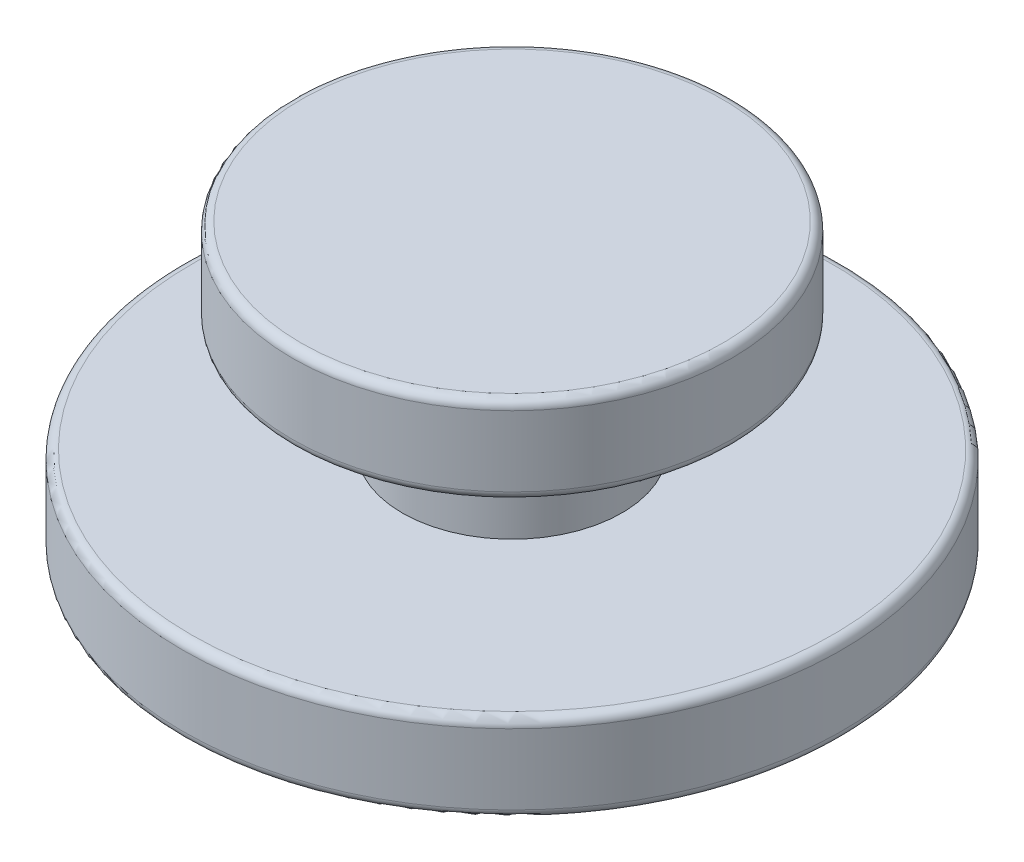
ISO-10303-21;
HEADER;
FILE_DESCRIPTION(('STEP AP214'),'2;1');
FILE_NAME('part.step','',(''),(''),'','','');
FILE_SCHEMA(('AUTOMOTIVE_DESIGN { 1 0 10303 214 1 1 1 1 }'));
ENDSEC;
DATA;
#1=APPLICATION_CONTEXT('core data for automotive mechanical design processes');
#2=APPLICATION_PROTOCOL_DEFINITION('international standard','automotive_design',2000,#1);
#3=PRODUCT_CONTEXT('',#1,'mechanical');
#4=PRODUCT('Part','Part','',(#3));
#5=PRODUCT_RELATED_PRODUCT_CATEGORY('part','',(#4));
#6=PRODUCT_DEFINITION_FORMATION('','',#4);
#7=PRODUCT_DEFINITION_CONTEXT('part definition',#1,'design');
#8=PRODUCT_DEFINITION('design','',#6,#7);
#9=PRODUCT_DEFINITION_SHAPE('','',#8);
#10=(LENGTH_UNIT() NAMED_UNIT(*) SI_UNIT(.MILLI.,.METRE.));
#11=(NAMED_UNIT(*) PLANE_ANGLE_UNIT() SI_UNIT($,.RADIAN.));
#12=(NAMED_UNIT(*) SI_UNIT($,.STERADIAN.) SOLID_ANGLE_UNIT());
#13=UNCERTAINTY_MEASURE_WITH_UNIT(LENGTH_MEASURE(1.E-05),#10,'distance_accuracy_value','');
#14=(GEOMETRIC_REPRESENTATION_CONTEXT(3) GLOBAL_UNCERTAINTY_ASSIGNED_CONTEXT((#13)) GLOBAL_UNIT_ASSIGNED_CONTEXT((#10,
#11,#12)) REPRESENTATION_CONTEXT('',''));
#15=CARTESIAN_POINT('',(0.,0.,0.));
#16=DIRECTION('',(0.,0.,1.));
#17=DIRECTION('',(1.,0.,0.));
#18=AXIS2_PLACEMENT_3D('',#15,#16,#17);
#19=CARTESIAN_POINT('',(0.,2.,0.));
#20=DIRECTION('',(0.,-1.,0.));
#21=DIRECTION('',(0.,0.,-1.));
#22=AXIS2_PLACEMENT_3D('',#19,#20,#21);
#23=CYLINDRICAL_SURFACE('',#22,7.5);
#24=CARTESIAN_POINT('',(0.,0.199999999999999,0.));
#25=DIRECTION('',(0.,1.,0.));
#26=DIRECTION('',(0.,0.,1.));
#27=AXIS2_PLACEMENT_3D('',#24,#25,#26);
#28=CIRCLE('',#27,7.5);
#29=CARTESIAN_POINT('',(0.,0.199999999999999,7.5));
#30=VERTEX_POINT('',#29);
#31=EDGE_CURVE('E73',#30,#30,#28,.T.);
#32=ORIENTED_EDGE('',*,*,#31,.T.);
#33=EDGE_LOOP('',(#32));
#34=FACE_BOUND('',#33,.T.);
#35=CARTESIAN_POINT('',(0.,1.8,0.));
#36=DIRECTION('',(0.,1.,0.));
#37=DIRECTION('',(0.,0.,1.));
#38=AXIS2_PLACEMENT_3D('',#35,#36,#37);
#39=CIRCLE('',#38,7.5);
#40=CARTESIAN_POINT('',(0.,1.8,7.5));
#41=VERTEX_POINT('',#40);
#42=EDGE_CURVE('E77',#41,#41,#39,.F.);
#43=ORIENTED_EDGE('',*,*,#42,.T.);
#44=EDGE_LOOP('',(#43));
#45=FACE_BOUND('',#44,.T.);
#46=ADVANCED_FACE('F39',(#34,#45),#23,.T.);
#47=CARTESIAN_POINT('',(0.,2.,0.));
#48=DIRECTION('',(0.,1.,0.));
#49=DIRECTION('',(0.,0.,1.));
#50=AXIS2_PLACEMENT_3D('',#47,#48,#49);
#51=PLANE('',#50);
#52=CARTESIAN_POINT('',(0.,2.,0.));
#53=DIRECTION('',(0.,1.,0.));
#54=DIRECTION('',(0.,0.,1.));
#55=AXIS2_PLACEMENT_3D('',#52,#53,#54);
#56=CIRCLE('',#55,7.3);
#57=CARTESIAN_POINT('',(0.,2.,7.3));
#58=VERTEX_POINT('',#57);
#59=EDGE_CURVE('E65',#58,#58,#56,.T.);
#60=ORIENTED_EDGE('',*,*,#59,.T.);
#61=EDGE_LOOP('',(#60));
#62=FACE_BOUND('',#61,.T.);
#63=CARTESIAN_POINT('',(0.,2.,0.));
#64=DIRECTION('',(0.,1.,0.));
#65=DIRECTION('',(0.,0.,1.));
#66=AXIS2_PLACEMENT_3D('',#63,#64,#65);
#67=CIRCLE('',#66,2.5);
#68=CARTESIAN_POINT('',(0.,2.,2.5));
#69=VERTEX_POINT('',#68);
#70=EDGE_CURVE('E81',#69,#69,#67,.T.);
#71=ORIENTED_EDGE('',*,*,#70,.F.);
#72=EDGE_LOOP('',(#71));
#73=FACE_BOUND('',#72,.T.);
#74=ADVANCED_FACE('F101',(#62,#73),#51,.T.);
#75=CARTESIAN_POINT('',(0.,0.,0.));
#76=DIRECTION('',(0.,1.,0.));
#77=DIRECTION('',(0.,0.,1.));
#78=AXIS2_PLACEMENT_3D('',#75,#76,#77);
#79=PLANE('',#78);
#80=CARTESIAN_POINT('',(0.,0.,0.));
#81=DIRECTION('',(0.,1.,0.));
#82=DIRECTION('',(0.,0.,1.));
#83=AXIS2_PLACEMENT_3D('',#80,#81,#82);
#84=CIRCLE('',#83,7.3);
#85=CARTESIAN_POINT('',(0.,0.,7.3));
#86=VERTEX_POINT('',#85);
#87=EDGE_CURVE('E69',#86,#86,#84,.F.);
#88=ORIENTED_EDGE('',*,*,#87,.T.);
#89=EDGE_LOOP('',(#88));
#90=FACE_BOUND('',#89,.T.);
#91=ADVANCED_FACE('F97',(#90),#79,.F.);
#92=CARTESIAN_POINT('',(0.,4.5,0.));
#93=DIRECTION('',(0.,-1.,0.));
#94=DIRECTION('',(0.,0.,-1.));
#95=AXIS2_PLACEMENT_3D('',#92,#93,#94);
#96=CYLINDRICAL_SURFACE('',#95,2.5);
#97=CARTESIAN_POINT('',(0.,4.5,0.));
#98=DIRECTION('',(0.,1.,0.));
#99=DIRECTION('',(0.,0.,1.));
#100=AXIS2_PLACEMENT_3D('',#97,#98,#99);
#101=CIRCLE('',#100,2.5);
#102=CARTESIAN_POINT('',(0.,4.5,2.5));
#103=VERTEX_POINT('',#102);
#104=EDGE_CURVE('E85',#103,#103,#101,.T.);
#105=ORIENTED_EDGE('',*,*,#104,.F.);
#106=EDGE_LOOP('',(#105));
#107=FACE_BOUND('',#106,.T.);
#108=ORIENTED_EDGE('',*,*,#70,.T.);
#109=EDGE_LOOP('',(#108));
#110=FACE_BOUND('',#109,.T.);
#111=ADVANCED_FACE('F93',(#107,#110),#96,.T.);
#112=CARTESIAN_POINT('',(0.,6.5,0.));
#113=DIRECTION('',(0.,-1.,0.));
#114=DIRECTION('',(0.,0.,-1.));
#115=AXIS2_PLACEMENT_3D('',#112,#113,#114);
#116=CYLINDRICAL_SURFACE('',#115,5.);
#117=CARTESIAN_POINT('',(0.,4.7,0.));
#118=DIRECTION('',(0.,1.,0.));
#119=DIRECTION('',(0.,0.,1.));
#120=AXIS2_PLACEMENT_3D('',#117,#118,#119);
#121=CIRCLE('',#120,5.);
#122=CARTESIAN_POINT('',(0.,4.7,5.));
#123=VERTEX_POINT('',#122);
#124=EDGE_CURVE('E53',#123,#123,#121,.T.);
#125=ORIENTED_EDGE('',*,*,#124,.T.);
#126=EDGE_LOOP('',(#125));
#127=FACE_BOUND('',#126,.T.);
#128=CARTESIAN_POINT('',(0.,6.3,0.));
#129=DIRECTION('',(0.,1.,0.));
#130=DIRECTION('',(0.,0.,1.));
#131=AXIS2_PLACEMENT_3D('',#128,#129,#130);
#132=CIRCLE('',#131,5.);
#133=CARTESIAN_POINT('',(0.,6.3,5.));
#134=VERTEX_POINT('',#133);
#135=EDGE_CURVE('E59',#134,#134,#132,.F.);
#136=ORIENTED_EDGE('',*,*,#135,.T.);
#137=EDGE_LOOP('',(#136));
#138=FACE_BOUND('',#137,.T.);
#139=ADVANCED_FACE('F96',(#127,#138),#116,.T.);
#140=CARTESIAN_POINT('',(0.,6.5,0.));
#141=DIRECTION('',(0.,1.,0.));
#142=DIRECTION('',(0.,0.,1.));
#143=AXIS2_PLACEMENT_3D('',#140,#141,#142);
#144=PLANE('',#143);
#145=CARTESIAN_POINT('',(0.,6.5,0.));
#146=DIRECTION('',(0.,1.,0.));
#147=DIRECTION('',(0.,0.,1.));
#148=AXIS2_PLACEMENT_3D('',#145,#146,#147);
#149=CIRCLE('',#148,4.8);
#150=CARTESIAN_POINT('',(0.,6.5,4.8));
#151=VERTEX_POINT('',#150);
#152=EDGE_CURVE('E10',#151,#151,#149,.T.);
#153=ORIENTED_EDGE('',*,*,#152,.T.);
#154=EDGE_LOOP('',(#153));
#155=FACE_BOUND('',#154,.T.);
#156=ADVANCED_FACE('F134',(#155),#144,.T.);
#157=CARTESIAN_POINT('',(0.,4.5,0.));
#158=DIRECTION('',(0.,1.,0.));
#159=DIRECTION('',(0.,0.,1.));
#160=AXIS2_PLACEMENT_3D('',#157,#158,#159);
#161=PLANE('',#160);
#162=CARTESIAN_POINT('',(0.,4.5,0.));
#163=DIRECTION('',(0.,1.,0.));
#164=DIRECTION('',(0.,0.,1.));
#165=AXIS2_PLACEMENT_3D('',#162,#163,#164);
#166=CIRCLE('',#165,4.8);
#167=CARTESIAN_POINT('',(0.,4.5,4.8));
#168=VERTEX_POINT('',#167);
#169=EDGE_CURVE('E47',#168,#168,#166,.F.);
#170=ORIENTED_EDGE('',*,*,#169,.T.);
#171=EDGE_LOOP('',(#170));
#172=FACE_BOUND('',#171,.T.);
#173=ORIENTED_EDGE('',*,*,#104,.T.);
#174=EDGE_LOOP('',(#173));
#175=FACE_BOUND('',#174,.T.);
#176=ADVANCED_FACE('F91',(#172,#175),#161,.F.);
#177=CARTESIAN_POINT('',(0.,0.199999999999999,0.));
#178=DIRECTION('',(0.,1.,0.));
#179=DIRECTION('',(0.,0.,1.));
#180=AXIS2_PLACEMENT_3D('',#177,#178,#179);
#181=TOROIDAL_SURFACE('',#180,7.3,0.2);
#182=ORIENTED_EDGE('',*,*,#87,.F.);
#183=EDGE_LOOP('',(#182));
#184=FACE_BOUND('',#183,.T.);
#185=ORIENTED_EDGE('',*,*,#31,.F.);
#186=EDGE_LOOP('',(#185));
#187=FACE_BOUND('',#186,.T.);
#188=ADVANCED_FACE('F115',(#184,#187),#181,.T.);
#189=CARTESIAN_POINT('',(0.,1.8,0.));
#190=DIRECTION('',(0.,1.,0.));
#191=DIRECTION('',(0.,0.,1.));
#192=AXIS2_PLACEMENT_3D('',#189,#190,#191);
#193=TOROIDAL_SURFACE('',#192,7.3,0.2);
#194=ORIENTED_EDGE('',*,*,#42,.F.);
#195=EDGE_LOOP('',(#194));
#196=FACE_BOUND('',#195,.T.);
#197=ORIENTED_EDGE('',*,*,#59,.F.);
#198=EDGE_LOOP('',(#197));
#199=FACE_BOUND('',#198,.T.);
#200=ADVANCED_FACE('F118',(#196,#199),#193,.T.);
#201=CARTESIAN_POINT('',(0.,4.7,0.));
#202=DIRECTION('',(0.,1.,0.));
#203=DIRECTION('',(0.,0.,1.));
#204=AXIS2_PLACEMENT_3D('',#201,#202,#203);
#205=TOROIDAL_SURFACE('',#204,4.8,0.2);
#206=ORIENTED_EDGE('',*,*,#169,.F.);
#207=EDGE_LOOP('',(#206));
#208=FACE_BOUND('',#207,.T.);
#209=ORIENTED_EDGE('',*,*,#124,.F.);
#210=EDGE_LOOP('',(#209));
#211=FACE_BOUND('',#210,.T.);
#212=ADVANCED_FACE('F121',(#208,#211),#205,.T.);
#213=CARTESIAN_POINT('',(0.,6.3,0.));
#214=DIRECTION('',(0.,1.,0.));
#215=DIRECTION('',(0.,0.,1.));
#216=AXIS2_PLACEMENT_3D('',#213,#214,#215);
#217=TOROIDAL_SURFACE('',#216,4.8,0.2);
#218=ORIENTED_EDGE('',*,*,#135,.F.);
#219=EDGE_LOOP('',(#218));
#220=FACE_BOUND('',#219,.T.);
#221=ORIENTED_EDGE('',*,*,#152,.F.);
#222=EDGE_LOOP('',(#221));
#223=FACE_BOUND('',#222,.T.);
#224=ADVANCED_FACE('F41',(#220,#223),#217,.T.);
#225=CLOSED_SHELL('',(#46,#74,#91,#111,#139,#156,#176,#188,#200,#212,#224));
#226=MANIFOLD_SOLID_BREP('B2',#225);
#227=ADVANCED_BREP_SHAPE_REPRESENTATION('',(#18,#226),#14);
#228=SHAPE_DEFINITION_REPRESENTATION(#9,#227);
ENDSEC;
END-ISO-10303-21;
